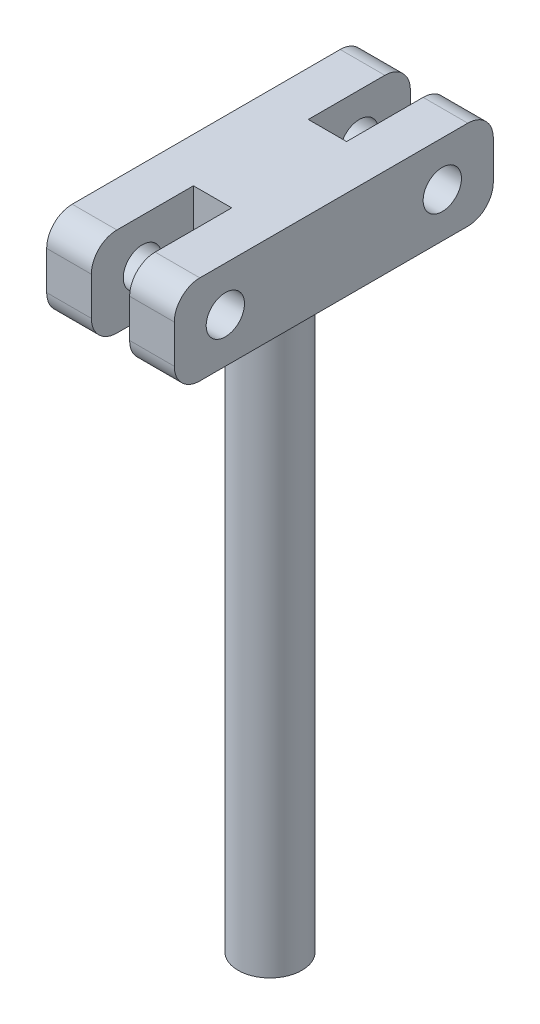
ISO-10303-21;
HEADER;
FILE_DESCRIPTION(('STEP AP214'),'2;1');
FILE_NAME('part.step','',(''),(''),'','','');
FILE_SCHEMA(('AUTOMOTIVE_DESIGN { 1 0 10303 214 1 1 1 1 }'));
ENDSEC;
DATA;
#1=APPLICATION_CONTEXT('core data for automotive mechanical design processes');
#2=APPLICATION_PROTOCOL_DEFINITION('international standard','automotive_design',2000,#1);
#3=PRODUCT_CONTEXT('',#1,'mechanical');
#4=PRODUCT('Part','Part','',(#3));
#5=PRODUCT_RELATED_PRODUCT_CATEGORY('part','',(#4));
#6=PRODUCT_DEFINITION_FORMATION('','',#4);
#7=PRODUCT_DEFINITION_CONTEXT('part definition',#1,'design');
#8=PRODUCT_DEFINITION('design','',#6,#7);
#9=PRODUCT_DEFINITION_SHAPE('','',#8);
#10=(LENGTH_UNIT() NAMED_UNIT(*) SI_UNIT(.MILLI.,.METRE.));
#11=(NAMED_UNIT(*) PLANE_ANGLE_UNIT() SI_UNIT($,.RADIAN.));
#12=(NAMED_UNIT(*) SI_UNIT($,.STERADIAN.) SOLID_ANGLE_UNIT());
#13=UNCERTAINTY_MEASURE_WITH_UNIT(LENGTH_MEASURE(1.E-05),#10,'distance_accuracy_value','');
#14=(GEOMETRIC_REPRESENTATION_CONTEXT(3) GLOBAL_UNCERTAINTY_ASSIGNED_CONTEXT((#13)) GLOBAL_UNIT_ASSIGNED_CONTEXT((#10,
#11,#12)) REPRESENTATION_CONTEXT('',''));
#15=CARTESIAN_POINT('',(0.,0.,0.));
#16=DIRECTION('',(0.,0.,1.));
#17=DIRECTION('',(1.,0.,0.));
#18=AXIS2_PLACEMENT_3D('',#15,#16,#17);
#19=CARTESIAN_POINT('',(5.,1.5,10.5));
#20=DIRECTION('',(-1.,0.,0.));
#21=DIRECTION('',(0.,0.,1.));
#22=AXIS2_PLACEMENT_3D('',#19,#20,#21);
#23=CYLINDRICAL_SURFACE('',#22,2.);
#24=DIRECTION('',(-1.,0.,0.));
#25=VECTOR('',#24,1.);
#26=CARTESIAN_POINT('',(5.,3.5,10.5));
#27=LINE('',#26,#25);
#28=CARTESIAN_POINT('',(5.,3.5,10.5));
#29=VERTEX_POINT('',#28);
#30=CARTESIAN_POINT('',(1.5,3.5,10.5));
#31=VERTEX_POINT('',#30);
#32=EDGE_CURVE('E299',#29,#31,#27,.T.);
#33=ORIENTED_EDGE('',*,*,#32,.T.);
#34=CARTESIAN_POINT('',(1.5,1.5,10.5));
#35=DIRECTION('',(1.,0.,0.));
#36=DIRECTION('',(0.,0.,-1.));
#37=AXIS2_PLACEMENT_3D('',#34,#35,#36);
#38=CIRCLE('',#37,2.);
#39=CARTESIAN_POINT('',(1.5,1.49999999999998,12.5));
#40=VERTEX_POINT('',#39);
#41=EDGE_CURVE('E236',#31,#40,#38,.T.);
#42=ORIENTED_EDGE('',*,*,#41,.T.);
#43=DIRECTION('',(-1.,0.,0.));
#44=VECTOR('',#43,1.);
#45=CARTESIAN_POINT('',(5.,1.5,12.5));
#46=LINE('',#45,#44);
#47=CARTESIAN_POINT('',(5.,1.5,12.5));
#48=VERTEX_POINT('',#47);
#49=EDGE_CURVE('E326',#48,#40,#46,.T.);
#50=ORIENTED_EDGE('',*,*,#49,.F.);
#51=CARTESIAN_POINT('',(5.,1.5,10.5));
#52=DIRECTION('',(1.,0.,0.));
#53=DIRECTION('',(0.,0.,1.));
#54=AXIS2_PLACEMENT_3D('',#51,#52,#53);
#55=CIRCLE('',#54,2.);
#56=EDGE_CURVE('E259',#29,#48,#55,.T.);
#57=ORIENTED_EDGE('',*,*,#56,.F.);
#58=EDGE_LOOP('',(#33,#42,#50,#57));
#59=FACE_BOUND('',#58,.T.);
#60=ADVANCED_FACE('F39',(#59),#23,.T.);
#61=CARTESIAN_POINT('',(5.,-1.5,12.5));
#62=DIRECTION('',(0.,0.,-1.));
#63=DIRECTION('',(-1.,0.,0.));
#64=AXIS2_PLACEMENT_3D('',#61,#62,#63);
#65=PLANE('',#64);
#66=ORIENTED_EDGE('',*,*,#49,.T.);
#67=DIRECTION('',(0.,1.,0.));
#68=VECTOR('',#67,1.);
#69=CARTESIAN_POINT('',(1.5,-50.,12.5));
#70=LINE('',#69,#68);
#71=CARTESIAN_POINT('',(1.5,-1.50000000000002,12.5));
#72=VERTEX_POINT('',#71);
#73=EDGE_CURVE('E355',#72,#40,#70,.T.);
#74=ORIENTED_EDGE('',*,*,#73,.F.);
#75=DIRECTION('',(-1.,0.,0.));
#76=VECTOR('',#75,1.);
#77=CARTESIAN_POINT('',(5.,-1.5,12.5));
#78=LINE('',#77,#76);
#79=CARTESIAN_POINT('',(5.,-1.5,12.5));
#80=VERTEX_POINT('',#79);
#81=EDGE_CURVE('E322',#80,#72,#78,.T.);
#82=ORIENTED_EDGE('',*,*,#81,.F.);
#83=DIRECTION('',(0.,-1.,0.));
#84=VECTOR('',#83,1.);
#85=CARTESIAN_POINT('',(5.,-1.5,12.5));
#86=LINE('',#85,#84);
#87=EDGE_CURVE('E262',#48,#80,#86,.T.);
#88=ORIENTED_EDGE('',*,*,#87,.F.);
#89=EDGE_LOOP('',(#66,#74,#82,#88));
#90=FACE_BOUND('',#89,.T.);
#91=ADVANCED_FACE('F392',(#90),#65,.F.);
#92=CARTESIAN_POINT('',(5.,-1.5,10.5));
#93=DIRECTION('',(-1.,0.,0.));
#94=DIRECTION('',(0.,0.,1.));
#95=AXIS2_PLACEMENT_3D('',#92,#93,#94);
#96=CYLINDRICAL_SURFACE('',#95,2.);
#97=ORIENTED_EDGE('',*,*,#81,.T.);
#98=CARTESIAN_POINT('',(1.5,-1.5,10.5));
#99=DIRECTION('',(1.,0.,0.));
#100=DIRECTION('',(0.,0.,-1.));
#101=AXIS2_PLACEMENT_3D('',#98,#99,#100);
#102=CIRCLE('',#101,2.);
#103=CARTESIAN_POINT('',(1.5,-3.5,10.5));
#104=VERTEX_POINT('',#103);
#105=EDGE_CURVE('E242',#72,#104,#102,.T.);
#106=ORIENTED_EDGE('',*,*,#105,.T.);
#107=DIRECTION('',(-1.,0.,0.));
#108=VECTOR('',#107,1.);
#109=CARTESIAN_POINT('',(5.,-3.5,10.5));
#110=LINE('',#109,#108);
#111=CARTESIAN_POINT('',(5.,-3.5,10.5));
#112=VERTEX_POINT('',#111);
#113=EDGE_CURVE('E318',#112,#104,#110,.T.);
#114=ORIENTED_EDGE('',*,*,#113,.F.);
#115=CARTESIAN_POINT('',(5.,-1.5,10.5));
#116=DIRECTION('',(1.,0.,0.));
#117=DIRECTION('',(0.,0.,-1.));
#118=AXIS2_PLACEMENT_3D('',#115,#116,#117);
#119=CIRCLE('',#118,2.);
#120=EDGE_CURVE('E265',#80,#112,#119,.T.);
#121=ORIENTED_EDGE('',*,*,#120,.F.);
#122=EDGE_LOOP('',(#97,#106,#114,#121));
#123=FACE_BOUND('',#122,.T.);
#124=ADVANCED_FACE('F414',(#123),#96,.T.);
#125=CARTESIAN_POINT('',(5.,-1.5,-10.5));
#126=DIRECTION('',(-1.,0.,0.));
#127=DIRECTION('',(0.,0.,1.));
#128=AXIS2_PLACEMENT_3D('',#125,#126,#127);
#129=CYLINDRICAL_SURFACE('',#128,2.);
#130=DIRECTION('',(-1.,0.,0.));
#131=VECTOR('',#130,1.);
#132=CARTESIAN_POINT('',(5.,-3.5,-10.5));
#133=LINE('',#132,#131);
#134=CARTESIAN_POINT('',(5.,-3.5,-10.5));
#135=VERTEX_POINT('',#134);
#136=CARTESIAN_POINT('',(1.5,-3.5,-10.5));
#137=VERTEX_POINT('',#136);
#138=EDGE_CURVE('E314',#135,#137,#133,.T.);
#139=ORIENTED_EDGE('',*,*,#138,.T.);
#140=CARTESIAN_POINT('',(1.5,-1.5,-10.5));
#141=DIRECTION('',(1.,0.,0.));
#142=DIRECTION('',(0.,0.,-1.));
#143=AXIS2_PLACEMENT_3D('',#140,#141,#142);
#144=CIRCLE('',#143,2.);
#145=CARTESIAN_POINT('',(1.5,-1.50000000000002,-12.5));
#146=VERTEX_POINT('',#145);
#147=EDGE_CURVE('E214',#137,#146,#144,.T.);
#148=ORIENTED_EDGE('',*,*,#147,.T.);
#149=DIRECTION('',(-1.,0.,0.));
#150=VECTOR('',#149,1.);
#151=CARTESIAN_POINT('',(5.,-1.5,-12.5));
#152=LINE('',#151,#150);
#153=CARTESIAN_POINT('',(5.,-1.5,-12.5));
#154=VERTEX_POINT('',#153);
#155=EDGE_CURVE('E311',#154,#146,#152,.T.);
#156=ORIENTED_EDGE('',*,*,#155,.F.);
#157=CARTESIAN_POINT('',(5.,-1.5,-10.5));
#158=DIRECTION('',(1.,0.,0.));
#159=DIRECTION('',(0.,0.,1.));
#160=AXIS2_PLACEMENT_3D('',#157,#158,#159);
#161=CIRCLE('',#160,2.);
#162=EDGE_CURVE('E269',#135,#154,#161,.T.);
#163=ORIENTED_EDGE('',*,*,#162,.F.);
#164=EDGE_LOOP('',(#139,#148,#156,#163));
#165=FACE_BOUND('',#164,.T.);
#166=ADVANCED_FACE('F409',(#165),#129,.T.);
#167=CARTESIAN_POINT('',(5.,-1.5,-12.5));
#168=DIRECTION('',(0.,0.,1.));
#169=DIRECTION('',(1.,0.,0.));
#170=AXIS2_PLACEMENT_3D('',#167,#168,#169);
#171=PLANE('',#170);
#172=ORIENTED_EDGE('',*,*,#155,.T.);
#173=DIRECTION('',(0.,1.,0.));
#174=VECTOR('',#173,1.);
#175=CARTESIAN_POINT('',(1.5,-50.,-12.5));
#176=LINE('',#175,#174);
#177=CARTESIAN_POINT('',(1.5,1.49999999999999,-12.5));
#178=VERTEX_POINT('',#177);
#179=EDGE_CURVE('E382',#146,#178,#176,.T.);
#180=ORIENTED_EDGE('',*,*,#179,.T.);
#181=DIRECTION('',(-1.,0.,0.));
#182=VECTOR('',#181,1.);
#183=CARTESIAN_POINT('',(5.,1.5,-12.5));
#184=LINE('',#183,#182);
#185=CARTESIAN_POINT('',(5.,1.5,-12.5));
#186=VERTEX_POINT('',#185);
#187=EDGE_CURVE('E307',#186,#178,#184,.T.);
#188=ORIENTED_EDGE('',*,*,#187,.F.);
#189=DIRECTION('',(0.,1.,0.));
#190=VECTOR('',#189,1.);
#191=CARTESIAN_POINT('',(5.,-1.5,-12.5));
#192=LINE('',#191,#190);
#193=EDGE_CURVE('E271',#154,#186,#192,.T.);
#194=ORIENTED_EDGE('',*,*,#193,.F.);
#195=EDGE_LOOP('',(#172,#180,#188,#194));
#196=FACE_BOUND('',#195,.T.);
#197=ADVANCED_FACE('F404',(#196),#171,.F.);
#198=CARTESIAN_POINT('',(5.,1.5,-10.5));
#199=DIRECTION('',(-1.,0.,0.));
#200=DIRECTION('',(0.,0.,1.));
#201=AXIS2_PLACEMENT_3D('',#198,#199,#200);
#202=CYLINDRICAL_SURFACE('',#201,2.);
#203=ORIENTED_EDGE('',*,*,#187,.T.);
#204=CARTESIAN_POINT('',(1.5,1.5,-10.5));
#205=DIRECTION('',(1.,0.,0.));
#206=DIRECTION('',(0.,0.,-1.));
#207=AXIS2_PLACEMENT_3D('',#204,#205,#206);
#208=CIRCLE('',#207,2.);
#209=CARTESIAN_POINT('',(1.5,3.5,-10.5));
#210=VERTEX_POINT('',#209);
#211=EDGE_CURVE('E211',#178,#210,#208,.T.);
#212=ORIENTED_EDGE('',*,*,#211,.T.);
#213=DIRECTION('',(-1.,0.,0.));
#214=VECTOR('',#213,1.);
#215=CARTESIAN_POINT('',(5.,3.5,-10.5));
#216=LINE('',#215,#214);
#217=CARTESIAN_POINT('',(5.,3.5,-10.5));
#218=VERTEX_POINT('',#217);
#219=EDGE_CURVE('E303',#218,#210,#216,.T.);
#220=ORIENTED_EDGE('',*,*,#219,.F.);
#221=CARTESIAN_POINT('',(5.,1.5,-10.5));
#222=DIRECTION('',(1.,0.,0.));
#223=DIRECTION('',(0.,0.,1.));
#224=AXIS2_PLACEMENT_3D('',#221,#222,#223);
#225=CIRCLE('',#224,2.);
#226=EDGE_CURVE('E273',#186,#218,#225,.T.);
#227=ORIENTED_EDGE('',*,*,#226,.F.);
#228=EDGE_LOOP('',(#203,#212,#220,#227));
#229=FACE_BOUND('',#228,.T.);
#230=ADVANCED_FACE('F401',(#229),#202,.T.);
#231=CARTESIAN_POINT('',(5.,0.,8.5));
#232=DIRECTION('',(-1.,0.,0.));
#233=DIRECTION('',(0.,0.,1.));
#234=AXIS2_PLACEMENT_3D('',#231,#232,#233);
#235=CYLINDRICAL_SURFACE('',#234,1.5);
#236=CARTESIAN_POINT('',(1.5,0.,8.5));
#237=DIRECTION('',(1.,0.,0.));
#238=DIRECTION('',(0.,0.,-1.));
#239=AXIS2_PLACEMENT_3D('',#236,#237,#238);
#240=CIRCLE('',#239,1.5);
#241=CARTESIAN_POINT('',(1.5,0.,7.));
#242=VERTEX_POINT('',#241);
#243=EDGE_CURVE('E232',#242,#242,#240,.T.);
#244=ORIENTED_EDGE('',*,*,#243,.F.);
#245=EDGE_LOOP('',(#244));
#246=FACE_BOUND('',#245,.T.);
#247=CARTESIAN_POINT('',(5.,0.,8.5));
#248=DIRECTION('',(1.,0.,0.));
#249=DIRECTION('',(0.,0.,-1.));
#250=AXIS2_PLACEMENT_3D('',#247,#248,#249);
#251=CIRCLE('',#250,1.5);
#252=CARTESIAN_POINT('',(5.,0.,7.));
#253=VERTEX_POINT('',#252);
#254=EDGE_CURVE('E253',#253,#253,#251,.T.);
#255=ORIENTED_EDGE('',*,*,#254,.T.);
#256=EDGE_LOOP('',(#255));
#257=FACE_BOUND('',#256,.T.);
#258=ADVANCED_FACE('F468',(#246,#257),#235,.F.);
#259=CARTESIAN_POINT('',(5.,0.,-8.49999999999999));
#260=DIRECTION('',(-1.,0.,0.));
#261=DIRECTION('',(0.,0.,1.));
#262=AXIS2_PLACEMENT_3D('',#259,#260,#261);
#263=CYLINDRICAL_SURFACE('',#262,1.5);
#264=CARTESIAN_POINT('',(1.5,0.,-8.49999999999999));
#265=DIRECTION('',(1.,0.,0.));
#266=DIRECTION('',(0.,0.,-1.));
#267=AXIS2_PLACEMENT_3D('',#264,#265,#266);
#268=CIRCLE('',#267,1.5);
#269=CARTESIAN_POINT('',(1.5,0.,-9.99999999999999));
#270=VERTEX_POINT('',#269);
#271=EDGE_CURVE('E200',#270,#270,#268,.T.);
#272=ORIENTED_EDGE('',*,*,#271,.F.);
#273=EDGE_LOOP('',(#272));
#274=FACE_BOUND('',#273,.T.);
#275=CARTESIAN_POINT('',(5.,0.,-8.49999999999999));
#276=DIRECTION('',(1.,0.,0.));
#277=DIRECTION('',(0.,0.,-1.));
#278=AXIS2_PLACEMENT_3D('',#275,#276,#277);
#279=CIRCLE('',#278,1.5);
#280=CARTESIAN_POINT('',(5.,0.,-9.99999999999999));
#281=VERTEX_POINT('',#280);
#282=EDGE_CURVE('E247',#281,#281,#279,.T.);
#283=ORIENTED_EDGE('',*,*,#282,.T.);
#284=EDGE_LOOP('',(#283));
#285=FACE_BOUND('',#284,.T.);
#286=ADVANCED_FACE('F463',(#274,#285),#263,.F.);
#287=CARTESIAN_POINT('',(5.,1.5,10.5));
#288=DIRECTION('',(-1.,0.,0.));
#289=DIRECTION('',(0.,0.,1.));
#290=AXIS2_PLACEMENT_3D('',#287,#288,#289);
#291=PLANE('',#290);
#292=ORIENTED_EDGE('',*,*,#56,.T.);
#293=ORIENTED_EDGE('',*,*,#87,.T.);
#294=ORIENTED_EDGE('',*,*,#120,.T.);
#295=DIRECTION('',(0.,0.,-1.));
#296=VECTOR('',#295,1.);
#297=CARTESIAN_POINT('',(5.,-3.5,-10.5));
#298=LINE('',#297,#296);
#299=EDGE_CURVE('E267',#112,#135,#298,.T.);
#300=ORIENTED_EDGE('',*,*,#299,.T.);
#301=ORIENTED_EDGE('',*,*,#162,.T.);
#302=ORIENTED_EDGE('',*,*,#193,.T.);
#303=ORIENTED_EDGE('',*,*,#226,.T.);
#304=DIRECTION('',(0.,0.,1.));
#305=VECTOR('',#304,1.);
#306=CARTESIAN_POINT('',(5.,3.5,-10.5));
#307=LINE('',#306,#305);
#308=EDGE_CURVE('E275',#218,#29,#307,.T.);
#309=ORIENTED_EDGE('',*,*,#308,.T.);
#310=EDGE_LOOP('',(#292,#293,#294,#300,#301,#302,#303,#309));
#311=FACE_BOUND('',#310,.T.);
#312=ORIENTED_EDGE('',*,*,#254,.F.);
#313=EDGE_LOOP('',(#312));
#314=FACE_BOUND('',#313,.T.);
#315=ORIENTED_EDGE('',*,*,#282,.F.);
#316=EDGE_LOOP('',(#315));
#317=FACE_BOUND('',#316,.T.);
#318=ADVANCED_FACE('F395',(#311,#314,#317),#291,.F.);
#319=CARTESIAN_POINT('',(-5.,1.5,10.5));
#320=DIRECTION('',(-1.,0.,0.));
#321=DIRECTION('',(0.,0.,1.));
#322=AXIS2_PLACEMENT_3D('',#319,#320,#321);
#323=PLANE('',#322);
#324=CARTESIAN_POINT('',(-5.,0.,8.5));
#325=DIRECTION('',(1.,0.,0.));
#326=DIRECTION('',(0.,0.,-1.));
#327=AXIS2_PLACEMENT_3D('',#324,#325,#326);
#328=CIRCLE('',#327,1.5);
#329=CARTESIAN_POINT('',(-5.,0.,7.));
#330=VERTEX_POINT('',#329);
#331=EDGE_CURVE('E250',#330,#330,#328,.T.);
#332=ORIENTED_EDGE('',*,*,#331,.T.);
#333=EDGE_LOOP('',(#332));
#334=FACE_BOUND('',#333,.T.);
#335=CARTESIAN_POINT('',(-5.,1.5,10.5));
#336=DIRECTION('',(1.,0.,0.));
#337=DIRECTION('',(0.,0.,1.));
#338=AXIS2_PLACEMENT_3D('',#335,#336,#337);
#339=CIRCLE('',#338,2.);
#340=CARTESIAN_POINT('',(-5.,3.5,10.5));
#341=VERTEX_POINT('',#340);
#342=CARTESIAN_POINT('',(-5.,1.5,12.5));
#343=VERTEX_POINT('',#342);
#344=EDGE_CURVE('E256',#341,#343,#339,.T.);
#345=ORIENTED_EDGE('',*,*,#344,.F.);
#346=DIRECTION('',(0.,0.,1.));
#347=VECTOR('',#346,1.);
#348=CARTESIAN_POINT('',(-5.,3.5,-10.5));
#349=LINE('',#348,#347);
#350=CARTESIAN_POINT('',(-5.,3.5,-10.5));
#351=VERTEX_POINT('',#350);
#352=EDGE_CURVE('E263',#351,#341,#349,.T.);
#353=ORIENTED_EDGE('',*,*,#352,.F.);
#354=CARTESIAN_POINT('',(-5.,1.5,-10.5));
#355=DIRECTION('',(1.,0.,0.));
#356=DIRECTION('',(0.,0.,1.));
#357=AXIS2_PLACEMENT_3D('',#354,#355,#356);
#358=CIRCLE('',#357,2.);
#359=CARTESIAN_POINT('',(-5.,1.5,-12.5));
#360=VERTEX_POINT('',#359);
#361=EDGE_CURVE('E294',#360,#351,#358,.T.);
#362=ORIENTED_EDGE('',*,*,#361,.F.);
#363=DIRECTION('',(0.,1.,0.));
#364=VECTOR('',#363,1.);
#365=CARTESIAN_POINT('',(-5.,-1.5,-12.5));
#366=LINE('',#365,#364);
#367=CARTESIAN_POINT('',(-5.,-1.5,-12.5));
#368=VERTEX_POINT('',#367);
#369=EDGE_CURVE('E291',#368,#360,#366,.T.);
#370=ORIENTED_EDGE('',*,*,#369,.F.);
#371=CARTESIAN_POINT('',(-5.,-1.5,-10.5));
#372=DIRECTION('',(1.,0.,0.));
#373=DIRECTION('',(0.,0.,1.));
#374=AXIS2_PLACEMENT_3D('',#371,#372,#373);
#375=CIRCLE('',#374,2.);
#376=CARTESIAN_POINT('',(-5.,-3.5,-10.5));
#377=VERTEX_POINT('',#376);
#378=EDGE_CURVE('E288',#377,#368,#375,.T.);
#379=ORIENTED_EDGE('',*,*,#378,.F.);
#380=DIRECTION('',(0.,0.,-1.));
#381=VECTOR('',#380,1.);
#382=CARTESIAN_POINT('',(-5.,-3.5,-10.5));
#383=LINE('',#382,#381);
#384=CARTESIAN_POINT('',(-5.,-3.5,10.5));
#385=VERTEX_POINT('',#384);
#386=EDGE_CURVE('E286',#385,#377,#383,.T.);
#387=ORIENTED_EDGE('',*,*,#386,.F.);
#388=CARTESIAN_POINT('',(-5.,-1.5,10.5));
#389=DIRECTION('',(1.,0.,0.));
#390=DIRECTION('',(0.,0.,-1.));
#391=AXIS2_PLACEMENT_3D('',#388,#389,#390);
#392=CIRCLE('',#391,2.);
#393=CARTESIAN_POINT('',(-5.,-1.5,12.5));
#394=VERTEX_POINT('',#393);
#395=EDGE_CURVE('E283',#394,#385,#392,.T.);
#396=ORIENTED_EDGE('',*,*,#395,.F.);
#397=DIRECTION('',(0.,-1.,0.));
#398=VECTOR('',#397,1.);
#399=CARTESIAN_POINT('',(-5.,-1.5,12.5));
#400=LINE('',#399,#398);
#401=EDGE_CURVE('E280',#343,#394,#400,.T.);
#402=ORIENTED_EDGE('',*,*,#401,.F.);
#403=EDGE_LOOP('',(#345,#353,#362,#370,#379,#387,#396,#402));
#404=FACE_BOUND('',#403,.T.);
#405=CARTESIAN_POINT('',(-5.,0.,-8.49999999999999));
#406=DIRECTION('',(1.,0.,0.));
#407=DIRECTION('',(0.,0.,-1.));
#408=AXIS2_PLACEMENT_3D('',#405,#406,#407);
#409=CIRCLE('',#408,1.5);
#410=CARTESIAN_POINT('',(-5.,0.,-9.99999999999999));
#411=VERTEX_POINT('',#410);
#412=EDGE_CURVE('E186',#411,#411,#409,.T.);
#413=ORIENTED_EDGE('',*,*,#412,.T.);
#414=EDGE_LOOP('',(#413));
#415=FACE_BOUND('',#414,.T.);
#416=ADVANCED_FACE('F374',(#334,#404,#415),#323,.T.);
#417=CARTESIAN_POINT('',(-1.5,1.49999999999998,12.5));
#418=VERTEX_POINT('',#417);
#419=EDGE_CURVE('E325',#418,#343,#46,.T.);
#420=ORIENTED_EDGE('',*,*,#419,.F.);
#421=CARTESIAN_POINT('',(-1.5,1.5,10.5));
#422=DIRECTION('',(-1.,0.,0.));
#423=DIRECTION('',(0.,0.,1.));
#424=AXIS2_PLACEMENT_3D('',#421,#422,#423);
#425=CIRCLE('',#424,2.);
#426=CARTESIAN_POINT('',(-1.5,3.5,10.5));
#427=VERTEX_POINT('',#426);
#428=EDGE_CURVE('E223',#418,#427,#425,.T.);
#429=ORIENTED_EDGE('',*,*,#428,.T.);
#430=EDGE_CURVE('E277',#427,#341,#27,.T.);
#431=ORIENTED_EDGE('',*,*,#430,.T.);
#432=ORIENTED_EDGE('',*,*,#344,.T.);
#433=EDGE_LOOP('',(#420,#429,#431,#432));
#434=FACE_BOUND('',#433,.T.);
#435=ADVANCED_FACE('F431',(#434),#23,.T.);
#436=CARTESIAN_POINT('',(-1.5,-1.5,12.5));
#437=VERTEX_POINT('',#436);
#438=EDGE_CURVE('E321',#437,#394,#78,.T.);
#439=ORIENTED_EDGE('',*,*,#438,.F.);
#440=DIRECTION('',(0.,1.,0.));
#441=VECTOR('',#440,1.);
#442=CARTESIAN_POINT('',(-1.5,-50.,12.5));
#443=LINE('',#442,#441);
#444=EDGE_CURVE('E352',#437,#418,#443,.T.);
#445=ORIENTED_EDGE('',*,*,#444,.T.);
#446=ORIENTED_EDGE('',*,*,#419,.T.);
#447=ORIENTED_EDGE('',*,*,#401,.T.);
#448=EDGE_LOOP('',(#439,#445,#446,#447));
#449=FACE_BOUND('',#448,.T.);
#450=ADVANCED_FACE('F425',(#449),#65,.F.);
#451=CARTESIAN_POINT('',(-1.5,-3.5,10.5));
#452=VERTEX_POINT('',#451);
#453=EDGE_CURVE('E317',#452,#385,#110,.T.);
#454=ORIENTED_EDGE('',*,*,#453,.F.);
#455=CARTESIAN_POINT('',(-1.5,-1.5,10.5));
#456=DIRECTION('',(-1.,0.,0.));
#457=DIRECTION('',(0.,0.,1.));
#458=AXIS2_PLACEMENT_3D('',#455,#456,#457);
#459=CIRCLE('',#458,2.);
#460=EDGE_CURVE('E229',#452,#437,#459,.T.);
#461=ORIENTED_EDGE('',*,*,#460,.T.);
#462=ORIENTED_EDGE('',*,*,#438,.T.);
#463=ORIENTED_EDGE('',*,*,#395,.T.);
#464=EDGE_LOOP('',(#454,#461,#462,#463));
#465=FACE_BOUND('',#464,.T.);
#466=ADVANCED_FACE('F417',(#465),#96,.T.);
#467=CARTESIAN_POINT('',(5.,-3.5,-10.5));
#468=DIRECTION('',(0.,1.,0.));
#469=DIRECTION('',(0.,0.,1.));
#470=AXIS2_PLACEMENT_3D('',#467,#468,#469);
#471=PLANE('',#470);
#472=DIRECTION('',(1.,0.,0.));
#473=VECTOR('',#472,1.);
#474=CARTESIAN_POINT('',(5.,-3.5,-4.5));
#475=LINE('',#474,#473);
#476=CARTESIAN_POINT('',(-1.5,-3.50000000000002,-4.5));
#477=VERTEX_POINT('',#476);
#478=CARTESIAN_POINT('',(1.5,-3.50000000000002,-4.5));
#479=VERTEX_POINT('',#478);
#480=EDGE_CURVE('E177',#477,#479,#475,.T.);
#481=ORIENTED_EDGE('',*,*,#480,.T.);
#482=DIRECTION('',(0.,0.,-1.));
#483=VECTOR('',#482,1.);
#484=CARTESIAN_POINT('',(1.5,-3.5,-10.5));
#485=LINE('',#484,#483);
#486=EDGE_CURVE('E217',#479,#137,#485,.T.);
#487=ORIENTED_EDGE('',*,*,#486,.T.);
#488=ORIENTED_EDGE('',*,*,#138,.F.);
#489=ORIENTED_EDGE('',*,*,#299,.F.);
#490=ORIENTED_EDGE('',*,*,#113,.T.);
#491=DIRECTION('',(0.,0.,-1.));
#492=VECTOR('',#491,1.);
#493=CARTESIAN_POINT('',(1.5,-3.5,-10.5));
#494=LINE('',#493,#492);
#495=CARTESIAN_POINT('',(1.5,-3.50000000000002,4.5));
#496=VERTEX_POINT('',#495);
#497=EDGE_CURVE('E239',#104,#496,#494,.T.);
#498=ORIENTED_EDGE('',*,*,#497,.T.);
#499=DIRECTION('',(-1.,0.,0.));
#500=VECTOR('',#499,1.);
#501=CARTESIAN_POINT('',(5.,-3.5,4.5));
#502=LINE('',#501,#500);
#503=CARTESIAN_POINT('',(-1.5,-3.50000000000002,4.5));
#504=VERTEX_POINT('',#503);
#505=EDGE_CURVE('E187',#496,#504,#502,.T.);
#506=ORIENTED_EDGE('',*,*,#505,.T.);
#507=DIRECTION('',(0.,0.,1.));
#508=VECTOR('',#507,1.);
#509=CARTESIAN_POINT('',(-1.5,-3.5,-10.5));
#510=LINE('',#509,#508);
#511=EDGE_CURVE('E226',#504,#452,#510,.T.);
#512=ORIENTED_EDGE('',*,*,#511,.T.);
#513=ORIENTED_EDGE('',*,*,#453,.T.);
#514=ORIENTED_EDGE('',*,*,#386,.T.);
#515=CARTESIAN_POINT('',(-1.5,-3.5,-10.5));
#516=VERTEX_POINT('',#515);
#517=EDGE_CURVE('E199',#516,#377,#133,.T.);
#518=ORIENTED_EDGE('',*,*,#517,.F.);
#519=DIRECTION('',(0.,0.,1.));
#520=VECTOR('',#519,1.);
#521=CARTESIAN_POINT('',(-1.5,-3.5,-10.5));
#522=LINE('',#521,#520);
#523=EDGE_CURVE('E190',#516,#477,#522,.T.);
#524=ORIENTED_EDGE('',*,*,#523,.T.);
#525=EDGE_LOOP('',(#481,#487,#488,#489,#490,#498,#506,#512,#513,#514,#518,#524));
#526=FACE_BOUND('',#525,.T.);
#527=CARTESIAN_POINT('',(0.,-3.5,0.));
#528=DIRECTION('',(0.,1.,0.));
#529=DIRECTION('',(0.,0.,1.));
#530=AXIS2_PLACEMENT_3D('',#527,#528,#529);
#531=CIRCLE('',#530,2.5);
#532=CARTESIAN_POINT('',(0.,-3.5,2.5));
#533=VERTEX_POINT('',#532);
#534=EDGE_CURVE('E329',#533,#533,#531,.F.);
#535=ORIENTED_EDGE('',*,*,#534,.F.);
#536=EDGE_LOOP('',(#535));
#537=FACE_BOUND('',#536,.T.);
#538=ADVANCED_FACE('F196',(#526,#537),#471,.F.);
#539=CARTESIAN_POINT('',(-1.5,-1.50000000000002,-12.5));
#540=VERTEX_POINT('',#539);
#541=EDGE_CURVE('E310',#540,#368,#152,.T.);
#542=ORIENTED_EDGE('',*,*,#541,.F.);
#543=CARTESIAN_POINT('',(-1.5,-1.5,-10.5));
#544=DIRECTION('',(-1.,0.,0.));
#545=DIRECTION('',(0.,0.,1.));
#546=AXIS2_PLACEMENT_3D('',#543,#544,#545);
#547=CIRCLE('',#546,2.);
#548=EDGE_CURVE('E201',#540,#516,#547,.T.);
#549=ORIENTED_EDGE('',*,*,#548,.T.);
#550=ORIENTED_EDGE('',*,*,#517,.T.);
#551=ORIENTED_EDGE('',*,*,#378,.T.);
#552=EDGE_LOOP('',(#542,#549,#550,#551));
#553=FACE_BOUND('',#552,.T.);
#554=ADVANCED_FACE('F423',(#553),#129,.T.);
#555=CARTESIAN_POINT('',(-1.5,1.49999999999999,-12.5));
#556=VERTEX_POINT('',#555);
#557=EDGE_CURVE('E306',#556,#360,#184,.T.);
#558=ORIENTED_EDGE('',*,*,#557,.F.);
#559=DIRECTION('',(0.,1.,0.));
#560=VECTOR('',#559,1.);
#561=CARTESIAN_POINT('',(-1.5,-50.,-12.5));
#562=LINE('',#561,#560);
#563=EDGE_CURVE('E193',#540,#556,#562,.T.);
#564=ORIENTED_EDGE('',*,*,#563,.F.);
#565=ORIENTED_EDGE('',*,*,#541,.T.);
#566=ORIENTED_EDGE('',*,*,#369,.T.);
#567=EDGE_LOOP('',(#558,#564,#565,#566));
#568=FACE_BOUND('',#567,.T.);
#569=ADVANCED_FACE('F366',(#568),#171,.F.);
#570=CARTESIAN_POINT('',(-1.5,3.5,-10.5));
#571=VERTEX_POINT('',#570);
#572=EDGE_CURVE('E302',#571,#351,#216,.T.);
#573=ORIENTED_EDGE('',*,*,#572,.F.);
#574=CARTESIAN_POINT('',(-1.5,1.5,-10.5));
#575=DIRECTION('',(-1.,0.,0.));
#576=DIRECTION('',(0.,0.,1.));
#577=AXIS2_PLACEMENT_3D('',#574,#575,#576);
#578=CIRCLE('',#577,2.);
#579=EDGE_CURVE('E62',#571,#556,#578,.T.);
#580=ORIENTED_EDGE('',*,*,#579,.T.);
#581=ORIENTED_EDGE('',*,*,#557,.T.);
#582=ORIENTED_EDGE('',*,*,#361,.T.);
#583=EDGE_LOOP('',(#573,#580,#581,#582));
#584=FACE_BOUND('',#583,.T.);
#585=ADVANCED_FACE('F363',(#584),#202,.T.);
#586=CARTESIAN_POINT('',(5.,3.5,-10.5));
#587=DIRECTION('',(0.,-1.,0.));
#588=DIRECTION('',(0.,0.,-1.));
#589=AXIS2_PLACEMENT_3D('',#586,#587,#588);
#590=PLANE('',#589);
#591=ORIENTED_EDGE('',*,*,#219,.T.);
#592=DIRECTION('',(0.,0.,1.));
#593=VECTOR('',#592,1.);
#594=CARTESIAN_POINT('',(1.5,3.5,-10.5));
#595=LINE('',#594,#593);
#596=CARTESIAN_POINT('',(1.5,3.49999999999999,-4.5));
#597=VERTEX_POINT('',#596);
#598=EDGE_CURVE('E204',#210,#597,#595,.T.);
#599=ORIENTED_EDGE('',*,*,#598,.T.);
#600=DIRECTION('',(-1.,0.,0.));
#601=VECTOR('',#600,1.);
#602=CARTESIAN_POINT('',(5.,3.5,-4.5));
#603=LINE('',#602,#601);
#604=CARTESIAN_POINT('',(-1.5,3.49999999999999,-4.5));
#605=VERTEX_POINT('',#604);
#606=EDGE_CURVE('E11',#597,#605,#603,.T.);
#607=ORIENTED_EDGE('',*,*,#606,.T.);
#608=DIRECTION('',(0.,0.,-1.));
#609=VECTOR('',#608,1.);
#610=CARTESIAN_POINT('',(-1.5,3.5,-10.5));
#611=LINE('',#610,#609);
#612=EDGE_CURVE('E192',#605,#571,#611,.T.);
#613=ORIENTED_EDGE('',*,*,#612,.T.);
#614=ORIENTED_EDGE('',*,*,#572,.T.);
#615=ORIENTED_EDGE('',*,*,#352,.T.);
#616=ORIENTED_EDGE('',*,*,#430,.F.);
#617=DIRECTION('',(0.,0.,-1.));
#618=VECTOR('',#617,1.);
#619=CARTESIAN_POINT('',(-1.5,3.5,-10.5));
#620=LINE('',#619,#618);
#621=CARTESIAN_POINT('',(-1.5,3.49999999999998,4.50000000000001));
#622=VERTEX_POINT('',#621);
#623=EDGE_CURVE('E220',#427,#622,#620,.T.);
#624=ORIENTED_EDGE('',*,*,#623,.T.);
#625=DIRECTION('',(1.,0.,0.));
#626=VECTOR('',#625,1.);
#627=CARTESIAN_POINT('',(5.,3.5,4.50000000000001));
#628=LINE('',#627,#626);
#629=CARTESIAN_POINT('',(1.5,3.5,4.50000000000001));
#630=VERTEX_POINT('',#629);
#631=EDGE_CURVE('E47',#622,#630,#628,.T.);
#632=ORIENTED_EDGE('',*,*,#631,.T.);
#633=DIRECTION('',(0.,0.,1.));
#634=VECTOR('',#633,1.);
#635=CARTESIAN_POINT('',(1.5,3.5,-10.5));
#636=LINE('',#635,#634);
#637=EDGE_CURVE('E233',#630,#31,#636,.T.);
#638=ORIENTED_EDGE('',*,*,#637,.T.);
#639=ORIENTED_EDGE('',*,*,#32,.F.);
#640=ORIENTED_EDGE('',*,*,#308,.F.);
#641=EDGE_LOOP('',(#591,#599,#607,#613,#614,#615,#616,#624,#632,#638,#639,#640));
#642=FACE_BOUND('',#641,.T.);
#643=ADVANCED_FACE('F343',(#642),#590,.F.);
#644=CARTESIAN_POINT('',(-1.5,0.,8.5));
#645=DIRECTION('',(-1.,0.,0.));
#646=DIRECTION('',(0.,0.,1.));
#647=AXIS2_PLACEMENT_3D('',#644,#645,#646);
#648=CIRCLE('',#647,1.5);
#649=CARTESIAN_POINT('',(-1.5,0.,10.));
#650=VERTEX_POINT('',#649);
#651=EDGE_CURVE('E219',#650,#650,#648,.T.);
#652=ORIENTED_EDGE('',*,*,#651,.F.);
#653=EDGE_LOOP('',(#652));
#654=FACE_BOUND('',#653,.T.);
#655=ORIENTED_EDGE('',*,*,#331,.F.);
#656=EDGE_LOOP('',(#655));
#657=FACE_BOUND('',#656,.T.);
#658=ADVANCED_FACE('F459',(#654,#657),#235,.F.);
#659=CARTESIAN_POINT('',(-1.5,0.,-8.49999999999999));
#660=DIRECTION('',(-1.,0.,0.));
#661=DIRECTION('',(0.,0.,1.));
#662=AXIS2_PLACEMENT_3D('',#659,#660,#661);
#663=CIRCLE('',#662,1.5);
#664=CARTESIAN_POINT('',(-1.5,0.,-7.));
#665=VERTEX_POINT('',#664);
#666=EDGE_CURVE('E335',#665,#665,#663,.T.);
#667=ORIENTED_EDGE('',*,*,#666,.F.);
#668=EDGE_LOOP('',(#667));
#669=FACE_BOUND('',#668,.T.);
#670=ORIENTED_EDGE('',*,*,#412,.F.);
#671=EDGE_LOOP('',(#670));
#672=FACE_BOUND('',#671,.T.);
#673=ADVANCED_FACE('F466',(#669,#672),#263,.F.);
#674=CARTESIAN_POINT('',(0.,-50.,0.));
#675=DIRECTION('',(0.,1.,0.));
#676=DIRECTION('',(0.,0.,1.));
#677=AXIS2_PLACEMENT_3D('',#674,#675,#676);
#678=CYLINDRICAL_SURFACE('',#677,2.5);
#679=CARTESIAN_POINT('',(0.,-50.,0.));
#680=DIRECTION('',(0.,1.,0.));
#681=DIRECTION('',(0.,0.,1.));
#682=AXIS2_PLACEMENT_3D('',#679,#680,#681);
#683=CIRCLE('',#682,2.5);
#684=CARTESIAN_POINT('',(0.,-50.,2.5));
#685=VERTEX_POINT('',#684);
#686=EDGE_CURVE('E330',#685,#685,#683,.T.);
#687=ORIENTED_EDGE('',*,*,#686,.T.);
#688=EDGE_LOOP('',(#687));
#689=FACE_BOUND('',#688,.T.);
#690=ORIENTED_EDGE('',*,*,#534,.T.);
#691=EDGE_LOOP('',(#690));
#692=FACE_BOUND('',#691,.T.);
#693=ADVANCED_FACE('F41',(#689,#692),#678,.T.);
#694=CARTESIAN_POINT('',(0.,-50.,0.));
#695=DIRECTION('',(0.,1.,0.));
#696=DIRECTION('',(0.,0.,1.));
#697=AXIS2_PLACEMENT_3D('',#694,#695,#696);
#698=PLANE('',#697);
#699=ORIENTED_EDGE('',*,*,#686,.F.);
#700=EDGE_LOOP('',(#699));
#701=FACE_BOUND('',#700,.T.);
#702=ADVANCED_FACE('F487',(#701),#698,.F.);
#703=CARTESIAN_POINT('',(-1.5,-50.,-4.5));
#704=DIRECTION('',(0.,0.,1.));
#705=DIRECTION('',(0.,-1.,0.));
#706=AXIS2_PLACEMENT_3D('',#703,#704,#705);
#707=PLANE('',#706);
#708=DIRECTION('',(0.,1.,0.));
#709=VECTOR('',#708,1.);
#710=CARTESIAN_POINT('',(-1.5,-50.,-4.5));
#711=LINE('',#710,#709);
#712=EDGE_CURVE('E180',#477,#605,#711,.T.);
#713=ORIENTED_EDGE('',*,*,#712,.T.);
#714=ORIENTED_EDGE('',*,*,#606,.F.);
#715=DIRECTION('',(0.,1.,0.));
#716=VECTOR('',#715,1.);
#717=CARTESIAN_POINT('',(1.5,-50.,-4.5));
#718=LINE('',#717,#716);
#719=EDGE_CURVE('E182',#479,#597,#718,.T.);
#720=ORIENTED_EDGE('',*,*,#719,.F.);
#721=ORIENTED_EDGE('',*,*,#480,.F.);
#722=EDGE_LOOP('',(#713,#714,#720,#721));
#723=FACE_BOUND('',#722,.T.);
#724=ADVANCED_FACE('F179',(#723),#707,.F.);
#725=CARTESIAN_POINT('',(1.5,-50.,-4.5));
#726=DIRECTION('',(1.,0.,0.));
#727=DIRECTION('',(0.,0.,-1.));
#728=AXIS2_PLACEMENT_3D('',#725,#726,#727);
#729=PLANE('',#728);
#730=ORIENTED_EDGE('',*,*,#271,.T.);
#731=EDGE_LOOP('',(#730));
#732=FACE_BOUND('',#731,.T.);
#733=ORIENTED_EDGE('',*,*,#719,.T.);
#734=ORIENTED_EDGE('',*,*,#598,.F.);
#735=ORIENTED_EDGE('',*,*,#211,.F.);
#736=ORIENTED_EDGE('',*,*,#179,.F.);
#737=ORIENTED_EDGE('',*,*,#147,.F.);
#738=ORIENTED_EDGE('',*,*,#486,.F.);
#739=EDGE_LOOP('',(#733,#734,#735,#736,#737,#738));
#740=FACE_BOUND('',#739,.T.);
#741=ADVANCED_FACE('F378',(#732,#740),#729,.F.);
#742=CARTESIAN_POINT('',(-1.5,-50.,-4.5));
#743=DIRECTION('',(-1.,0.,0.));
#744=DIRECTION('',(0.,0.,1.));
#745=AXIS2_PLACEMENT_3D('',#742,#743,#744);
#746=PLANE('',#745);
#747=ORIENTED_EDGE('',*,*,#666,.T.);
#748=EDGE_LOOP('',(#747));
#749=FACE_BOUND('',#748,.T.);
#750=ORIENTED_EDGE('',*,*,#548,.F.);
#751=ORIENTED_EDGE('',*,*,#563,.T.);
#752=ORIENTED_EDGE('',*,*,#579,.F.);
#753=ORIENTED_EDGE('',*,*,#612,.F.);
#754=ORIENTED_EDGE('',*,*,#712,.F.);
#755=ORIENTED_EDGE('',*,*,#523,.F.);
#756=EDGE_LOOP('',(#750,#751,#752,#753,#754,#755));
#757=FACE_BOUND('',#756,.T.);
#758=ADVANCED_FACE('F189',(#749,#757),#746,.F.);
#759=CARTESIAN_POINT('',(-1.5,-50.,4.5));
#760=DIRECTION('',(0.,0.,-1.));
#761=DIRECTION('',(0.,1.,0.));
#762=AXIS2_PLACEMENT_3D('',#759,#760,#761);
#763=PLANE('',#762);
#764=DIRECTION('',(0.,1.,0.));
#765=VECTOR('',#764,1.);
#766=CARTESIAN_POINT('',(1.5,-50.,4.5));
#767=LINE('',#766,#765);
#768=EDGE_CURVE('E54',#496,#630,#767,.T.);
#769=ORIENTED_EDGE('',*,*,#768,.T.);
#770=ORIENTED_EDGE('',*,*,#631,.F.);
#771=DIRECTION('',(0.,1.,0.));
#772=VECTOR('',#771,1.);
#773=CARTESIAN_POINT('',(-1.5,-50.,4.5));
#774=LINE('',#773,#772);
#775=EDGE_CURVE('E349',#504,#622,#774,.T.);
#776=ORIENTED_EDGE('',*,*,#775,.F.);
#777=ORIENTED_EDGE('',*,*,#505,.F.);
#778=EDGE_LOOP('',(#769,#770,#776,#777));
#779=FACE_BOUND('',#778,.T.);
#780=ADVANCED_FACE('F348',(#779),#763,.F.);
#781=CARTESIAN_POINT('',(1.5,-50.,4.5));
#782=DIRECTION('',(1.,0.,0.));
#783=DIRECTION('',(0.,0.,-1.));
#784=AXIS2_PLACEMENT_3D('',#781,#782,#783);
#785=PLANE('',#784);
#786=ORIENTED_EDGE('',*,*,#243,.T.);
#787=EDGE_LOOP('',(#786));
#788=FACE_BOUND('',#787,.T.);
#789=ORIENTED_EDGE('',*,*,#73,.T.);
#790=ORIENTED_EDGE('',*,*,#41,.F.);
#791=ORIENTED_EDGE('',*,*,#637,.F.);
#792=ORIENTED_EDGE('',*,*,#768,.F.);
#793=ORIENTED_EDGE('',*,*,#497,.F.);
#794=ORIENTED_EDGE('',*,*,#105,.F.);
#795=EDGE_LOOP('',(#789,#790,#791,#792,#793,#794));
#796=FACE_BOUND('',#795,.T.);
#797=ADVANCED_FACE('F386',(#788,#796),#785,.F.);
#798=CARTESIAN_POINT('',(-1.5,-50.,4.5));
#799=DIRECTION('',(-1.,0.,0.));
#800=DIRECTION('',(0.,0.,1.));
#801=AXIS2_PLACEMENT_3D('',#798,#799,#800);
#802=PLANE('',#801);
#803=ORIENTED_EDGE('',*,*,#651,.T.);
#804=EDGE_LOOP('',(#803));
#805=FACE_BOUND('',#804,.T.);
#806=ORIENTED_EDGE('',*,*,#511,.F.);
#807=ORIENTED_EDGE('',*,*,#775,.T.);
#808=ORIENTED_EDGE('',*,*,#623,.F.);
#809=ORIENTED_EDGE('',*,*,#428,.F.);
#810=ORIENTED_EDGE('',*,*,#444,.F.);
#811=ORIENTED_EDGE('',*,*,#460,.F.);
#812=EDGE_LOOP('',(#806,#807,#808,#809,#810,#811));
#813=FACE_BOUND('',#812,.T.);
#814=ADVANCED_FACE('F351',(#805,#813),#802,.F.);
#815=CLOSED_SHELL('',(#60,#91,#124,#166,#197,#230,#258,#286,#318,#416,#435,#450,#466,#538,#554,
#569,#585,#643,#658,#673,#693,#702,#724,#741,#758,#780,#797,#814));
#816=MANIFOLD_SOLID_BREP('B2',#815);
#817=ADVANCED_BREP_SHAPE_REPRESENTATION('',(#18,#816),#14);
#818=SHAPE_DEFINITION_REPRESENTATION(#9,#817);
ENDSEC;
END-ISO-10303-21;
